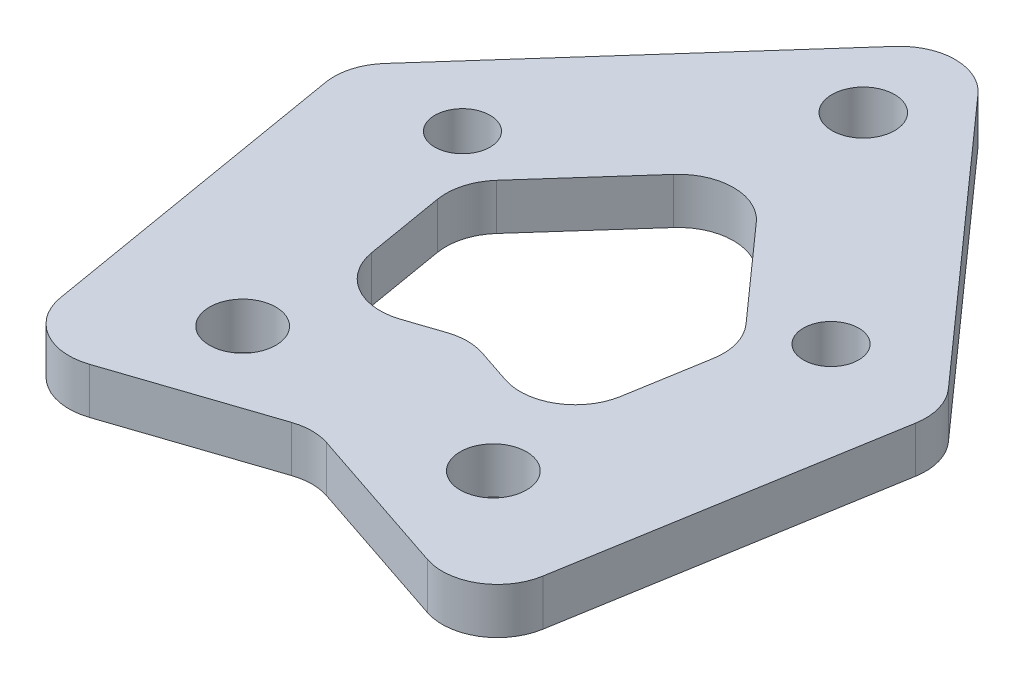
ISO-10303-21;
HEADER;
FILE_DESCRIPTION(('STEP AP214'),'2;1');
FILE_NAME('part.step','',(''),(''),'','','');
FILE_SCHEMA(('AUTOMOTIVE_DESIGN { 1 0 10303 214 1 1 1 1 }'));
ENDSEC;
DATA;
#1=APPLICATION_CONTEXT('core data for automotive mechanical design processes');
#2=APPLICATION_PROTOCOL_DEFINITION('international standard','automotive_design',2000,#1);
#3=PRODUCT_CONTEXT('',#1,'mechanical');
#4=PRODUCT('Part','Part','',(#3));
#5=PRODUCT_RELATED_PRODUCT_CATEGORY('part','',(#4));
#6=PRODUCT_DEFINITION_FORMATION('','',#4);
#7=PRODUCT_DEFINITION_CONTEXT('part definition',#1,'design');
#8=PRODUCT_DEFINITION('design','',#6,#7);
#9=PRODUCT_DEFINITION_SHAPE('','',#8);
#10=(LENGTH_UNIT() NAMED_UNIT(*) SI_UNIT(.MILLI.,.METRE.));
#11=(NAMED_UNIT(*) PLANE_ANGLE_UNIT() SI_UNIT($,.RADIAN.));
#12=(NAMED_UNIT(*) SI_UNIT($,.STERADIAN.) SOLID_ANGLE_UNIT());
#13=UNCERTAINTY_MEASURE_WITH_UNIT(LENGTH_MEASURE(1.E-05),#10,'distance_accuracy_value','');
#14=(GEOMETRIC_REPRESENTATION_CONTEXT(3) GLOBAL_UNCERTAINTY_ASSIGNED_CONTEXT((#13)) GLOBAL_UNIT_ASSIGNED_CONTEXT((#10,
#11,#12)) REPRESENTATION_CONTEXT('',''));
#15=CARTESIAN_POINT('',(0.,0.,0.));
#16=DIRECTION('',(0.,0.,1.));
#17=DIRECTION('',(1.,0.,0.));
#18=AXIS2_PLACEMENT_3D('',#15,#16,#17);
#19=CARTESIAN_POINT('',(32.3850000005408,1.5875,-43.1799999978764));
#20=DIRECTION('',(-0.746844593870613,0.,0.664998610980683));
#21=DIRECTION('',(0.664998610980683,0.,0.746844593870614));
#22=AXIS2_PLACEMENT_3D('',#19,#20,#21);
#23=PLANE('',#22);
#24=DIRECTION('',(-0.664998610980683,0.,-0.746844593870614));
#25=VECTOR('',#24,1.);
#26=CARTESIAN_POINT('',(32.3850000005408,-1.5875,-43.1799999978764));
#27=LINE('',#26,#25);
#28=CARTESIAN_POINT('',(51.8065062711757,-1.5875,-21.3681544939327));
#29=VERTEX_POINT('',#28);
#30=CARTESIAN_POINT('',(35.2304779031879,-1.5875,-39.9843094302882));
#31=VERTEX_POINT('',#30);
#32=EDGE_CURVE('E329',#29,#31,#27,.T.);
#33=ORIENTED_EDGE('',*,*,#32,.T.);
#34=DIRECTION('',(0.,-1.,0.));
#35=VECTOR('',#34,1.);
#36=CARTESIAN_POINT('',(35.2304779031879,1.5875,-39.9843094302882));
#37=LINE('',#36,#35);
#38=CARTESIAN_POINT('',(35.2304779031879,1.5875,-39.9843094302882));
#39=VERTEX_POINT('',#38);
#40=EDGE_CURVE('E465',#31,#39,#37,.F.);
#41=ORIENTED_EDGE('',*,*,#40,.T.);
#42=DIRECTION('',(-0.664998610980683,0.,-0.746844593870614));
#43=VECTOR('',#42,1.);
#44=CARTESIAN_POINT('',(32.3850000005408,1.5875,-43.1799999978764));
#45=LINE('',#44,#43);
#46=CARTESIAN_POINT('',(51.8065062711757,1.5875,-21.3681544939327));
#47=VERTEX_POINT('',#46);
#48=EDGE_CURVE('E333',#47,#39,#45,.T.);
#49=ORIENTED_EDGE('',*,*,#48,.F.);
#50=DIRECTION('',(0.,-1.,0.));
#51=VECTOR('',#50,1.);
#52=CARTESIAN_POINT('',(51.8065062711757,1.5875,-21.3681544939327));
#53=LINE('',#52,#51);
#54=EDGE_CURVE('E461',#47,#29,#53,.T.);
#55=ORIENTED_EDGE('',*,*,#54,.T.);
#56=EDGE_LOOP('',(#33,#41,#49,#55));
#57=FACE_BOUND('',#56,.T.);
#58=ADVANCED_FACE('F49',(#57),#23,.F.);
#59=CARTESIAN_POINT('',(11.7475000005408,1.5875,-20.0024999978764));
#60=DIRECTION('',(0.746844593870614,0.,0.664998610980683));
#61=DIRECTION('',(0.664998610980683,0.,-0.746844593870614));
#62=AXIS2_PLACEMENT_3D('',#59,#60,#61);
#63=PLANE('',#62);
#64=DIRECTION('',(-0.664998610980683,0.,0.746844593870614));
#65=VECTOR('',#64,1.);
#66=CARTESIAN_POINT('',(11.7475000005408,-1.5875,-20.0024999978764));
#67=LINE('',#66,#65);
#68=CARTESIAN_POINT('',(29.5395220978938,-1.5875,-39.9843094302882));
#69=VERTEX_POINT('',#68);
#70=CARTESIAN_POINT('',(12.963493729906,-1.5875,-21.3681544939327));
#71=VERTEX_POINT('',#70);
#72=EDGE_CURVE('E361',#69,#71,#67,.T.);
#73=ORIENTED_EDGE('',*,*,#72,.T.);
#74=DIRECTION('',(0.,-1.,0.));
#75=VECTOR('',#74,1.);
#76=CARTESIAN_POINT('',(12.963493729906,1.5875,-21.3681544939327));
#77=LINE('',#76,#75);
#78=CARTESIAN_POINT('',(12.963493729906,1.5875,-21.3681544939327));
#79=VERTEX_POINT('',#78);
#80=EDGE_CURVE('E458',#71,#79,#77,.F.);
#81=ORIENTED_EDGE('',*,*,#80,.T.);
#82=DIRECTION('',(-0.664998610980683,0.,0.746844593870614));
#83=VECTOR('',#82,1.);
#84=CARTESIAN_POINT('',(11.7475000005408,1.5875,-20.0024999978764));
#85=LINE('',#84,#83);
#86=CARTESIAN_POINT('',(29.5395220978938,1.5875,-39.9843094302882));
#87=VERTEX_POINT('',#86);
#88=EDGE_CURVE('E337',#87,#79,#85,.T.);
#89=ORIENTED_EDGE('',*,*,#88,.F.);
#90=DIRECTION('',(0.,-1.,0.));
#91=VECTOR('',#90,1.);
#92=CARTESIAN_POINT('',(29.5395220978938,1.5875,-39.9843094302882));
#93=LINE('',#92,#91);
#94=EDGE_CURVE('E455',#87,#69,#93,.T.);
#95=ORIENTED_EDGE('',*,*,#94,.T.);
#96=EDGE_LOOP('',(#73,#81,#89,#95));
#97=FACE_BOUND('',#96,.T.);
#98=ADVANCED_FACE('F550',(#97),#63,.F.);
#99=CARTESIAN_POINT('',(11.7475000005408,1.5875,-20.0024999978764));
#100=DIRECTION('',(0.986013297183269,0.,-0.166666666666667));
#101=DIRECTION('',(-0.166666666666667,0.,-0.98601329718327));
#102=AXIS2_PLACEMENT_3D('',#99,#100,#101);
#103=PLANE('',#102);
#104=DIRECTION('',(0.166666666666667,0.,0.986013297183269));
#105=VECTOR('',#104,1.);
#106=CARTESIAN_POINT('',(11.7475000005408,1.5875,-20.0024999978764));
#107=LINE('',#106,#105);
#108=CARTESIAN_POINT('',(12.0522609702848,1.5875,-18.1995097860963));
#109=VERTEX_POINT('',#108);
#110=CARTESIAN_POINT('',(15.7675907402736,1.5875,3.7806775536828));
#111=VERTEX_POINT('',#110);
#112=EDGE_CURVE('E342',#109,#111,#107,.T.);
#113=ORIENTED_EDGE('',*,*,#112,.F.);
#114=DIRECTION('',(0.,-1.,0.));
#115=VECTOR('',#114,1.);
#116=CARTESIAN_POINT('',(12.0522609702848,1.5875,-18.1995097860963));
#117=LINE('',#116,#115);
#118=CARTESIAN_POINT('',(12.0522609702848,-1.5875,-18.1995097860963));
#119=VERTEX_POINT('',#118);
#120=EDGE_CURVE('E451',#109,#119,#117,.T.);
#121=ORIENTED_EDGE('',*,*,#120,.T.);
#122=DIRECTION('',(0.166666666666667,0.,0.986013297183269));
#123=VECTOR('',#122,1.);
#124=CARTESIAN_POINT('',(11.7475000005408,-1.5875,-20.0024999978764));
#125=LINE('',#124,#123);
#126=CARTESIAN_POINT('',(15.7675907402736,-1.5875,3.7806775536828));
#127=VERTEX_POINT('',#126);
#128=EDGE_CURVE('E364',#119,#127,#125,.T.);
#129=ORIENTED_EDGE('',*,*,#128,.T.);
#130=DIRECTION('',(0.,-1.,0.));
#131=VECTOR('',#130,1.);
#132=CARTESIAN_POINT('',(15.7675907402736,1.5875,3.7806775536828));
#133=LINE('',#132,#131);
#134=EDGE_CURVE('E448',#127,#111,#133,.F.);
#135=ORIENTED_EDGE('',*,*,#134,.T.);
#136=EDGE_LOOP('',(#113,#121,#129,#135));
#137=FACE_BOUND('',#136,.T.);
#138=ADVANCED_FACE('F558',(#137),#103,.F.);
#139=CARTESIAN_POINT('',(16.5100000005408,1.5875,8.17282996913553));
#140=DIRECTION('',(-0.317499609648524,0.,-0.948258402479533));
#141=DIRECTION('',(-0.948258402479533,0.,0.317499609648524));
#142=AXIS2_PLACEMENT_3D('',#139,#140,#141);
#143=PLANE('',#142);
#144=DIRECTION('',(0.948258402479533,0.,-0.317499609648524));
#145=VECTOR('',#144,1.);
#146=CARTESIAN_POINT('',(16.5100000005408,-1.5875,8.17282996913553));
#147=LINE('',#146,#145);
#148=CARTESIAN_POINT('',(20.7339749153028,-1.5875,6.75854206712982));
#149=VERTEX_POINT('',#148);
#150=CARTESIAN_POINT('',(31.17532648778,-1.5875,3.26252764764666));
#151=VERTEX_POINT('',#150);
#152=EDGE_CURVE('E368',#149,#151,#147,.T.);
#153=ORIENTED_EDGE('',*,*,#152,.T.);
#154=DIRECTION('',(0.,-1.,0.));
#155=VECTOR('',#154,1.);
#156=CARTESIAN_POINT('',(31.17532648778,1.5875,3.26252764764667));
#157=LINE('',#156,#155);
#158=CARTESIAN_POINT('',(31.17532648778,1.5875,3.26252764764666));
#159=VERTEX_POINT('',#158);
#160=EDGE_CURVE('E260',#151,#159,#157,.F.);
#161=ORIENTED_EDGE('',*,*,#160,.T.);
#162=DIRECTION('',(0.948258402479533,0.,-0.317499609648524));
#163=VECTOR('',#162,1.);
#164=CARTESIAN_POINT('',(16.5100000005408,1.5875,8.17282996913553));
#165=LINE('',#164,#163);
#166=CARTESIAN_POINT('',(20.7339749153028,1.5875,6.75854206712982));
#167=VERTEX_POINT('',#166);
#168=EDGE_CURVE('E346',#167,#159,#165,.T.);
#169=ORIENTED_EDGE('',*,*,#168,.F.);
#170=DIRECTION('',(0.,-1.,0.));
#171=VECTOR('',#170,1.);
#172=CARTESIAN_POINT('',(20.7339749153028,1.5875,6.75854206712982));
#173=LINE('',#172,#171);
#174=EDGE_CURVE('E482',#167,#149,#173,.T.);
#175=ORIENTED_EDGE('',*,*,#174,.T.);
#176=EDGE_LOOP('',(#153,#161,#169,#175));
#177=FACE_BOUND('',#176,.T.);
#178=ADVANCED_FACE('F520',(#177),#143,.F.);
#179=CARTESIAN_POINT('',(32.3850000005408,1.5875,2.85750000212361));
#180=DIRECTION('',(0.317499609648524,0.,-0.948258402479533));
#181=DIRECTION('',(-0.948258402479533,0.,-0.317499609648524));
#182=AXIS2_PLACEMENT_3D('',#179,#180,#181);
#183=PLANE('',#182);
#184=DIRECTION('',(0.948258402479533,0.,0.317499609648524));
#185=VECTOR('',#184,1.);
#186=CARTESIAN_POINT('',(32.3850000005408,1.5875,2.85750000212361));
#187=LINE('',#186,#185);
#188=CARTESIAN_POINT('',(33.5946735133017,1.5875,3.26252764764667));
#189=VERTEX_POINT('',#188);
#190=CARTESIAN_POINT('',(44.0360250857789,1.5875,6.75854206712982));
#191=VERTEX_POINT('',#190);
#192=EDGE_CURVE('E350',#189,#191,#187,.T.);
#193=ORIENTED_EDGE('',*,*,#192,.F.);
#194=DIRECTION('',(0.,-1.,0.));
#195=VECTOR('',#194,1.);
#196=CARTESIAN_POINT('',(33.5946735133017,-1.5875,3.26252764764667));
#197=LINE('',#196,#195);
#198=CARTESIAN_POINT('',(33.5946735133017,-1.5875,3.26252764764667));
#199=VERTEX_POINT('',#198);
#200=EDGE_CURVE('E478',#189,#199,#197,.T.);
#201=ORIENTED_EDGE('',*,*,#200,.T.);
#202=DIRECTION('',(0.948258402479533,0.,0.317499609648524));
#203=VECTOR('',#202,1.);
#204=CARTESIAN_POINT('',(32.3850000005408,-1.5875,2.85750000212361));
#205=LINE('',#204,#203);
#206=CARTESIAN_POINT('',(44.0360250857789,-1.5875,6.75854206712982));
#207=VERTEX_POINT('',#206);
#208=EDGE_CURVE('E372',#199,#207,#205,.T.);
#209=ORIENTED_EDGE('',*,*,#208,.T.);
#210=DIRECTION('',(0.,-1.,0.));
#211=VECTOR('',#210,1.);
#212=CARTESIAN_POINT('',(44.0360250857789,1.5875,6.75854206712982));
#213=LINE('',#212,#211);
#214=EDGE_CURVE('E475',#207,#191,#213,.F.);
#215=ORIENTED_EDGE('',*,*,#214,.T.);
#216=EDGE_LOOP('',(#193,#201,#209,#215));
#217=FACE_BOUND('',#216,.T.);
#218=ADVANCED_FACE('F529',(#217),#183,.F.);
#219=CARTESIAN_POINT('',(48.2600000005408,1.5875,8.17282996913553));
#220=DIRECTION('',(-0.986013297183269,0.,-0.166666666666667));
#221=DIRECTION('',(-0.166666666666667,0.,0.986013297183269));
#222=AXIS2_PLACEMENT_3D('',#219,#220,#221);
#223=PLANE('',#222);
#224=DIRECTION('',(0.166666666666667,0.,-0.986013297183269));
#225=VECTOR('',#224,1.);
#226=CARTESIAN_POINT('',(48.2600000005408,-1.5875,8.17282996913553));
#227=LINE('',#226,#225);
#228=CARTESIAN_POINT('',(49.002409260808,-1.5875,3.7806775536828));
#229=VERTEX_POINT('',#228);
#230=CARTESIAN_POINT('',(52.7177390307969,-1.5875,-18.1995097860963));
#231=VERTEX_POINT('',#230);
#232=EDGE_CURVE('E338',#229,#231,#227,.T.);
#233=ORIENTED_EDGE('',*,*,#232,.T.);
#234=DIRECTION('',(0.,-1.,0.));
#235=VECTOR('',#234,1.);
#236=CARTESIAN_POINT('',(52.7177390307969,1.5875,-18.1995097860963));
#237=LINE('',#236,#235);
#238=CARTESIAN_POINT('',(52.7177390307969,1.5875,-18.1995097860963));
#239=VERTEX_POINT('',#238);
#240=EDGE_CURVE('E472',#231,#239,#237,.F.);
#241=ORIENTED_EDGE('',*,*,#240,.T.);
#242=DIRECTION('',(0.166666666666667,0.,-0.986013297183269));
#243=VECTOR('',#242,1.);
#244=CARTESIAN_POINT('',(48.2600000005408,1.5875,8.17282996913553));
#245=LINE('',#244,#243);
#246=CARTESIAN_POINT('',(49.002409260808,1.5875,3.7806775536828));
#247=VERTEX_POINT('',#246);
#248=EDGE_CURVE('E354',#247,#239,#245,.T.);
#249=ORIENTED_EDGE('',*,*,#248,.F.);
#250=DIRECTION('',(0.,-1.,0.));
#251=VECTOR('',#250,1.);
#252=CARTESIAN_POINT('',(49.002409260808,1.5875,3.7806775536828));
#253=LINE('',#252,#251);
#254=EDGE_CURVE('E468',#247,#229,#253,.T.);
#255=ORIENTED_EDGE('',*,*,#254,.T.);
#256=EDGE_LOOP('',(#233,#241,#249,#255));
#257=FACE_BOUND('',#256,.T.);
#258=ADVANCED_FACE('F536',(#257),#223,.F.);
#259=CARTESIAN_POINT('',(0.,1.5875,0.));
#260=DIRECTION('',(0.,1.,0.));
#261=DIRECTION('',(0.,0.,1.));
#262=AXIS2_PLACEMENT_3D('',#259,#260,#261);
#263=PLANE('',#262);
#264=DIRECTION('',(0.948258402479533,0.,0.317499609648524));
#265=VECTOR('',#264,1.);
#266=CARTESIAN_POINT('',(32.3850000005408,1.5875,-7.85687908846324));
#267=LINE('',#266,#265);
#268=CARTESIAN_POINT('',(33.5946735133017,1.5875,-7.45185144294019));
#269=VERTEX_POINT('',#268);
#270=CARTESIAN_POINT('',(35.9978880137761,1.5875,-6.6471977074108));
#271=VERTEX_POINT('',#270);
#272=EDGE_CURVE('E288',#269,#271,#267,.T.);
#273=ORIENTED_EDGE('',*,*,#272,.F.);
#274=CARTESIAN_POINT('',(32.3850000005408,1.5875,-3.83898692949317));
#275=DIRECTION('',(0.,1.,0.));
#276=DIRECTION('',(0.,0.,1.));
#277=AXIS2_PLACEMENT_3D('',#274,#275,#276);
#278=CIRCLE('',#277,3.81);
#279=CARTESIAN_POINT('',(31.17532648778,1.5875,-7.45185144294019));
#280=VERTEX_POINT('',#279);
#281=EDGE_CURVE('E408',#269,#280,#278,.T.);
#282=ORIENTED_EDGE('',*,*,#281,.T.);
#283=DIRECTION('',(0.948258402479533,0.,-0.317499609648524));
#284=VECTOR('',#283,1.);
#285=CARTESIAN_POINT('',(24.5481370725437,1.5875,-5.23290980540509));
#286=LINE('',#285,#284);
#287=CARTESIAN_POINT('',(28.7721119873056,1.5875,-6.6471977074108));
#288=VERTEX_POINT('',#287);
#289=EDGE_CURVE('E870',#288,#280,#286,.T.);
#290=ORIENTED_EDGE('',*,*,#289,.F.);
#291=CARTESIAN_POINT('',(27.5624384745447,1.5875,-10.2600622208578));
#292=DIRECTION('',(0.,1.,0.));
#293=DIRECTION('',(0.,0.,1.));
#294=AXIS2_PLACEMENT_3D('',#291,#292,#293);
#295=CIRCLE('',#294,3.81);
#296=CARTESIAN_POINT('',(23.8057278122765,1.5875,-9.62506222085782));
#297=VERTEX_POINT('',#296);
#298=EDGE_CURVE('E496',#288,#297,#295,.F.);
#299=ORIENTED_EDGE('',*,*,#298,.T.);
#300=DIRECTION('',(0.166666666666666,0.,0.986013297183269));
#301=VECTOR('',#300,1.);
#302=CARTESIAN_POINT('',(22.5780910192401,1.5875,-16.8878594331294));
#303=LINE('',#302,#301);
#304=CARTESIAN_POINT('',(22.8828519889841,1.5875,-15.0848692213493));
#305=VERTEX_POINT('',#304);
#306=EDGE_CURVE('E872',#305,#297,#303,.T.);
#307=ORIENTED_EDGE('',*,*,#306,.F.);
#308=CARTESIAN_POINT('',(26.6395626512523,1.5875,-15.7198692213493));
#309=DIRECTION('',(0.,1.,0.));
#310=DIRECTION('',(0.,0.,1.));
#311=AXIS2_PLACEMENT_3D('',#308,#309,#310);
#312=CIRCLE('',#311,3.81);
#313=CARTESIAN_POINT('',(23.7940847486053,1.5875,-18.2535139291857));
#314=VERTEX_POINT('',#313);
#315=EDGE_CURVE('E502',#305,#314,#312,.F.);
#316=ORIENTED_EDGE('',*,*,#315,.T.);
#317=DIRECTION('',(-0.664998610980683,0.,0.746844593870614));
#318=VECTOR('',#317,1.);
#319=CARTESIAN_POINT('',(32.3850000005408,1.5875,-27.9017725967441));
#320=LINE('',#319,#318);
#321=CARTESIAN_POINT('',(29.5395220978938,1.5875,-24.7060820291559));
#322=VERTEX_POINT('',#321);
#323=EDGE_CURVE('E878',#322,#314,#320,.T.);
#324=ORIENTED_EDGE('',*,*,#323,.F.);
#325=CARTESIAN_POINT('',(32.3850000005408,1.5875,-22.1724373213195));
#326=DIRECTION('',(0.,1.,0.));
#327=DIRECTION('',(0.,0.,1.));
#328=AXIS2_PLACEMENT_3D('',#325,#326,#327);
#329=CIRCLE('',#328,3.81);
#330=CARTESIAN_POINT('',(35.2304779031879,1.5875,-24.7060820291559));
#331=VERTEX_POINT('',#330);
#332=EDGE_CURVE('E278',#322,#331,#329,.F.);
#333=ORIENTED_EDGE('',*,*,#332,.T.);
#334=DIRECTION('',(-0.664998610980683,0.,-0.746844593870613));
#335=VECTOR('',#334,1.);
#336=CARTESIAN_POINT('',(42.1919089818416,1.5875,-16.8878594331294));
#337=LINE('',#336,#335);
#338=CARTESIAN_POINT('',(40.9759152524764,1.5875,-18.2535139291857));
#339=VERTEX_POINT('',#338);
#340=EDGE_CURVE('E266',#339,#331,#337,.T.);
#341=ORIENTED_EDGE('',*,*,#340,.F.);
#342=CARTESIAN_POINT('',(38.1304373498294,1.5875,-15.7198692213493));
#343=DIRECTION('',(0.,1.,0.));
#344=DIRECTION('',(0.,0.,1.));
#345=AXIS2_PLACEMENT_3D('',#342,#343,#344);
#346=CIRCLE('',#345,3.81);
#347=CARTESIAN_POINT('',(41.8871480120976,1.5875,-15.0848692213493));
#348=VERTEX_POINT('',#347);
#349=EDGE_CURVE('E248',#339,#348,#346,.F.);
#350=ORIENTED_EDGE('',*,*,#349,.T.);
#351=DIRECTION('',(0.166666666666666,0.,-0.986013297183269));
#352=VECTOR('',#351,1.);
#353=CARTESIAN_POINT('',(40.221862928538,1.5875,-5.23290980540509));
#354=LINE('',#353,#352);
#355=CARTESIAN_POINT('',(40.9642721888052,1.5875,-9.62506222085782));
#356=VERTEX_POINT('',#355);
#357=EDGE_CURVE('E281',#356,#348,#354,.T.);
#358=ORIENTED_EDGE('',*,*,#357,.F.);
#359=CARTESIAN_POINT('',(37.207561526537,1.5875,-10.2600622208578));
#360=DIRECTION('',(0.,1.,0.));
#361=DIRECTION('',(0.,0.,1.));
#362=AXIS2_PLACEMENT_3D('',#359,#360,#361);
#363=CIRCLE('',#362,3.81);
#364=EDGE_CURVE('E490',#356,#271,#363,.F.);
#365=ORIENTED_EDGE('',*,*,#364,.T.);
#366=EDGE_LOOP('',(#273,#282,#290,#299,#307,#316,#324,#333,#341,#350,#358,#365));
#367=FACE_BOUND('',#366,.T.);
#368=CARTESIAN_POINT('',(23.7474827219681,1.5875,-0.795511848872547));
#369=DIRECTION('',(0.,1.,0.));
#370=DIRECTION('',(0.,0.,1.));
#371=AXIS2_PLACEMENT_3D('',#368,#369,#370);
#372=CIRCLE('',#371,2.28600000002914);
#373=CARTESIAN_POINT('',(23.7474827219681,1.5875,1.49048815115659));
#374=VERTEX_POINT('',#373);
#375=EDGE_CURVE('E321',#374,#374,#372,.T.);
#376=ORIENTED_EDGE('',*,*,#375,.F.);
#377=EDGE_LOOP('',(#376));
#378=FACE_BOUND('',#377,.T.);
#379=CARTESIAN_POINT('',(41.0225172791136,1.5875,-0.79551184887255));
#380=DIRECTION('',(0.,1.,0.));
#381=DIRECTION('',(0.,0.,-1.));
#382=AXIS2_PLACEMENT_3D('',#379,#380,#381);
#383=CIRCLE('',#382,2.28600000002914);
#384=CARTESIAN_POINT('',(41.0225172791136,1.5875,-3.08151184890169));
#385=VERTEX_POINT('',#384);
#386=EDGE_CURVE('E313',#385,#385,#383,.T.);
#387=ORIENTED_EDGE('',*,*,#386,.F.);
#388=EDGE_LOOP('',(#387));
#389=FACE_BOUND('',#388,.T.);
#390=CARTESIAN_POINT('',(32.3850000005408,1.5875,-34.9250000245181));
#391=DIRECTION('',(0.,1.,0.));
#392=DIRECTION('',(0.,0.,1.));
#393=AXIS2_PLACEMENT_3D('',#390,#391,#392);
#394=CIRCLE('',#393,2.15900000155991);
#395=CARTESIAN_POINT('',(32.3850000005408,1.5875,-32.7660000229582));
#396=VERTEX_POINT('',#395);
#397=EDGE_CURVE('E305',#396,#396,#394,.T.);
#398=ORIENTED_EDGE('',*,*,#397,.F.);
#399=EDGE_LOOP('',(#398));
#400=FACE_BOUND('',#399,.T.);
#401=CARTESIAN_POINT('',(45.0849999984229,1.5875,-20.0024999997719));
#402=DIRECTION('',(0.,1.,0.));
#403=DIRECTION('',(0.,0.,1.));
#404=AXIS2_PLACEMENT_3D('',#401,#402,#403);
#405=CIRCLE('',#404,1.90500000157267);
#406=CARTESIAN_POINT('',(45.0849999984229,1.5875,-18.0974999981992));
#407=VERTEX_POINT('',#406);
#408=EDGE_CURVE('E297',#407,#407,#405,.T.);
#409=ORIENTED_EDGE('',*,*,#408,.F.);
#410=EDGE_LOOP('',(#409));
#411=FACE_BOUND('',#410,.T.);
#412=CARTESIAN_POINT('',(19.684999998424,1.5875,-20.0025000024673));
#413=DIRECTION('',(0.,1.,0.));
#414=DIRECTION('',(0.,0.,1.));
#415=AXIS2_PLACEMENT_3D('',#412,#413,#414);
#416=CIRCLE('',#415,1.90500000078473);
#417=CARTESIAN_POINT('',(19.684999998424,1.5875,-18.0975000016826));
#418=VERTEX_POINT('',#417);
#419=EDGE_CURVE('E325',#418,#418,#416,.T.);
#420=ORIENTED_EDGE('',*,*,#419,.F.);
#421=EDGE_LOOP('',(#420));
#422=FACE_BOUND('',#421,.T.);
#423=ORIENTED_EDGE('',*,*,#88,.T.);
#424=CARTESIAN_POINT('',(15.8089716325531,1.5875,-18.8345097860963));
#425=DIRECTION('',(0.,1.,0.));
#426=DIRECTION('',(0.,0.,1.));
#427=AXIS2_PLACEMENT_3D('',#424,#425,#426);
#428=CIRCLE('',#427,3.81);
#429=EDGE_CURVE('E405',#79,#109,#428,.T.);
#430=ORIENTED_EDGE('',*,*,#429,.T.);
#431=ORIENTED_EDGE('',*,*,#112,.T.);
#432=CARTESIAN_POINT('',(19.5243014025419,1.5875,3.1456775536828));
#433=DIRECTION('',(0.,1.,0.));
#434=DIRECTION('',(0.,0.,1.));
#435=AXIS2_PLACEMENT_3D('',#432,#433,#434);
#436=CIRCLE('',#435,3.81);
#437=EDGE_CURVE('E396',#111,#167,#436,.T.);
#438=ORIENTED_EDGE('',*,*,#437,.T.);
#439=ORIENTED_EDGE('',*,*,#168,.T.);
#440=CARTESIAN_POINT('',(32.3850000005408,1.5875,6.87539216109368));
#441=DIRECTION('',(0.,1.,0.));
#442=DIRECTION('',(0.,0.,1.));
#443=AXIS2_PLACEMENT_3D('',#440,#441,#442);
#444=CIRCLE('',#443,3.81);
#445=EDGE_CURVE('E11',#159,#189,#444,.F.);
#446=ORIENTED_EDGE('',*,*,#445,.T.);
#447=ORIENTED_EDGE('',*,*,#192,.T.);
#448=CARTESIAN_POINT('',(45.2456985985398,1.5875,3.1456775536828));
#449=DIRECTION('',(0.,1.,0.));
#450=DIRECTION('',(0.,0.,1.));
#451=AXIS2_PLACEMENT_3D('',#448,#449,#450);
#452=CIRCLE('',#451,3.81);
#453=EDGE_CURVE('E393',#191,#247,#452,.T.);
#454=ORIENTED_EDGE('',*,*,#453,.T.);
#455=ORIENTED_EDGE('',*,*,#248,.T.);
#456=CARTESIAN_POINT('',(48.9610283685286,1.5875,-18.8345097860963));
#457=DIRECTION('',(0.,1.,0.));
#458=DIRECTION('',(0.,0.,1.));
#459=AXIS2_PLACEMENT_3D('',#456,#457,#458);
#460=CIRCLE('',#459,3.81);
#461=EDGE_CURVE('E399',#239,#47,#460,.T.);
#462=ORIENTED_EDGE('',*,*,#461,.T.);
#463=ORIENTED_EDGE('',*,*,#48,.T.);
#464=CARTESIAN_POINT('',(32.3850000005408,1.5875,-37.4506647224518));
#465=DIRECTION('',(0.,1.,0.));
#466=DIRECTION('',(0.,0.,1.));
#467=AXIS2_PLACEMENT_3D('',#464,#465,#466);
#468=CIRCLE('',#467,3.81);
#469=EDGE_CURVE('E402',#39,#87,#468,.T.);
#470=ORIENTED_EDGE('',*,*,#469,.T.);
#471=EDGE_LOOP('',(#423,#430,#431,#438,#439,#446,#447,#454,#455,#462,#463,#470));
#472=FACE_BOUND('',#471,.T.);
#473=ADVANCED_FACE('F275',(#367,#378,#389,#400,#411,#422,#472),#263,.T.);
#474=CARTESIAN_POINT('',(0.,-1.5875,0.));
#475=DIRECTION('',(0.,1.,0.));
#476=DIRECTION('',(0.,0.,1.));
#477=AXIS2_PLACEMENT_3D('',#474,#475,#476);
#478=PLANE('',#477);
#479=DIRECTION('',(0.948258402479533,0.,-0.317499609648524));
#480=VECTOR('',#479,1.);
#481=CARTESIAN_POINT('',(24.5481370725437,-1.5875,-5.23290980540509));
#482=LINE('',#481,#480);
#483=CARTESIAN_POINT('',(28.7721119873056,-1.5875,-6.6471977074108));
#484=VERTEX_POINT('',#483);
#485=CARTESIAN_POINT('',(31.17532648778,-1.5875,-7.45185144294019));
#486=VERTEX_POINT('',#485);
#487=EDGE_CURVE('E839',#484,#486,#482,.T.);
#488=ORIENTED_EDGE('',*,*,#487,.T.);
#489=CARTESIAN_POINT('',(32.3850000005408,-1.5875,-3.83898692949317));
#490=DIRECTION('',(0.,1.,0.));
#491=DIRECTION('',(0.,0.,1.));
#492=AXIS2_PLACEMENT_3D('',#489,#490,#491);
#493=CIRCLE('',#492,3.81);
#494=CARTESIAN_POINT('',(33.5946735133017,-1.5875,-7.45185144294019));
#495=VERTEX_POINT('',#494);
#496=EDGE_CURVE('E431',#486,#495,#493,.F.);
#497=ORIENTED_EDGE('',*,*,#496,.T.);
#498=DIRECTION('',(0.948258402479533,0.,0.317499609648524));
#499=VECTOR('',#498,1.);
#500=CARTESIAN_POINT('',(32.3850000005408,-1.5875,-7.85687908846324));
#501=LINE('',#500,#499);
#502=CARTESIAN_POINT('',(35.9978880137761,-1.5875,-6.6471977074108));
#503=VERTEX_POINT('',#502);
#504=EDGE_CURVE('E861',#495,#503,#501,.T.);
#505=ORIENTED_EDGE('',*,*,#504,.T.);
#506=CARTESIAN_POINT('',(37.207561526537,-1.5875,-10.2600622208578));
#507=DIRECTION('',(0.,1.,0.));
#508=DIRECTION('',(0.,0.,1.));
#509=AXIS2_PLACEMENT_3D('',#506,#507,#508);
#510=CIRCLE('',#509,3.81);
#511=CARTESIAN_POINT('',(40.9642721888052,-1.5875,-9.62506222085782));
#512=VERTEX_POINT('',#511);
#513=EDGE_CURVE('E493',#503,#512,#510,.T.);
#514=ORIENTED_EDGE('',*,*,#513,.T.);
#515=DIRECTION('',(0.166666666666666,0.,-0.986013297183269));
#516=VECTOR('',#515,1.);
#517=CARTESIAN_POINT('',(40.221862928538,-1.5875,-5.23290980540509));
#518=LINE('',#517,#516);
#519=CARTESIAN_POINT('',(41.8871480120976,-1.5875,-15.0848692213493));
#520=VERTEX_POINT('',#519);
#521=EDGE_CURVE('E884',#512,#520,#518,.T.);
#522=ORIENTED_EDGE('',*,*,#521,.T.);
#523=CARTESIAN_POINT('',(38.1304373498294,-1.5875,-15.7198692213493));
#524=DIRECTION('',(0.,1.,0.));
#525=DIRECTION('',(0.,0.,1.));
#526=AXIS2_PLACEMENT_3D('',#523,#524,#525);
#527=CIRCLE('',#526,3.81);
#528=CARTESIAN_POINT('',(40.9759152524764,-1.5875,-18.2535139291857));
#529=VERTEX_POINT('',#528);
#530=EDGE_CURVE('E259',#520,#529,#527,.T.);
#531=ORIENTED_EDGE('',*,*,#530,.T.);
#532=DIRECTION('',(-0.664998610980683,0.,-0.746844593870613));
#533=VECTOR('',#532,1.);
#534=CARTESIAN_POINT('',(42.1919089818416,-1.5875,-16.8878594331294));
#535=LINE('',#534,#533);
#536=CARTESIAN_POINT('',(35.2304779031879,-1.5875,-24.7060820291559));
#537=VERTEX_POINT('',#536);
#538=EDGE_CURVE('E269',#529,#537,#535,.T.);
#539=ORIENTED_EDGE('',*,*,#538,.T.);
#540=CARTESIAN_POINT('',(32.3850000005408,-1.5875,-22.1724373213195));
#541=DIRECTION('',(0.,1.,0.));
#542=DIRECTION('',(0.,0.,1.));
#543=AXIS2_PLACEMENT_3D('',#540,#541,#542);
#544=CIRCLE('',#543,3.81);
#545=CARTESIAN_POINT('',(29.5395220978938,-1.5875,-24.7060820291559));
#546=VERTEX_POINT('',#545);
#547=EDGE_CURVE('E510',#537,#546,#544,.T.);
#548=ORIENTED_EDGE('',*,*,#547,.T.);
#549=DIRECTION('',(-0.664998610980683,0.,0.746844593870614));
#550=VECTOR('',#549,1.);
#551=CARTESIAN_POINT('',(32.3850000005408,-1.5875,-27.9017725967441));
#552=LINE('',#551,#550);
#553=CARTESIAN_POINT('',(23.7940847486053,-1.5875,-18.2535139291857));
#554=VERTEX_POINT('',#553);
#555=EDGE_CURVE('E280',#546,#554,#552,.T.);
#556=ORIENTED_EDGE('',*,*,#555,.T.);
#557=CARTESIAN_POINT('',(26.6395626512523,-1.5875,-15.7198692213493));
#558=DIRECTION('',(0.,1.,0.));
#559=DIRECTION('',(0.,0.,1.));
#560=AXIS2_PLACEMENT_3D('',#557,#558,#559);
#561=CIRCLE('',#560,3.81);
#562=CARTESIAN_POINT('',(22.8828519889841,-1.5875,-15.0848692213493));
#563=VERTEX_POINT('',#562);
#564=EDGE_CURVE('E505',#554,#563,#561,.T.);
#565=ORIENTED_EDGE('',*,*,#564,.T.);
#566=DIRECTION('',(0.166666666666666,0.,0.986013297183269));
#567=VECTOR('',#566,1.);
#568=CARTESIAN_POINT('',(22.5780910192401,-1.5875,-16.8878594331294));
#569=LINE('',#568,#567);
#570=CARTESIAN_POINT('',(23.8057278122765,-1.5875,-9.62506222085782));
#571=VERTEX_POINT('',#570);
#572=EDGE_CURVE('E286',#563,#571,#569,.T.);
#573=ORIENTED_EDGE('',*,*,#572,.T.);
#574=CARTESIAN_POINT('',(27.5624384745447,-1.5875,-10.2600622208578));
#575=DIRECTION('',(0.,1.,0.));
#576=DIRECTION('',(0.,0.,1.));
#577=AXIS2_PLACEMENT_3D('',#574,#575,#576);
#578=CIRCLE('',#577,3.81);
#579=EDGE_CURVE('E499',#571,#484,#578,.T.);
#580=ORIENTED_EDGE('',*,*,#579,.T.);
#581=EDGE_LOOP('',(#488,#497,#505,#514,#522,#531,#539,#548,#556,#565,#573,#580));
#582=FACE_BOUND('',#581,.T.);
#583=CARTESIAN_POINT('',(23.7474827219681,-1.5875,-0.795511848872547));
#584=DIRECTION('',(0.,1.,0.));
#585=DIRECTION('',(0.,0.,1.));
#586=AXIS2_PLACEMENT_3D('',#583,#584,#585);
#587=CIRCLE('',#586,2.28600000002914);
#588=CARTESIAN_POINT('',(23.7474827219681,-1.5875,1.49048815115659));
#589=VERTEX_POINT('',#588);
#590=EDGE_CURVE('E317',#589,#589,#587,.T.);
#591=ORIENTED_EDGE('',*,*,#590,.T.);
#592=EDGE_LOOP('',(#591));
#593=FACE_BOUND('',#592,.T.);
#594=CARTESIAN_POINT('',(41.0225172791136,-1.5875,-0.79551184887255));
#595=DIRECTION('',(0.,1.,0.));
#596=DIRECTION('',(0.,0.,-1.));
#597=AXIS2_PLACEMENT_3D('',#594,#595,#596);
#598=CIRCLE('',#597,2.28600000002914);
#599=CARTESIAN_POINT('',(41.0225172791136,-1.5875,-3.08151184890169));
#600=VERTEX_POINT('',#599);
#601=EDGE_CURVE('E309',#600,#600,#598,.T.);
#602=ORIENTED_EDGE('',*,*,#601,.T.);
#603=EDGE_LOOP('',(#602));
#604=FACE_BOUND('',#603,.T.);
#605=CARTESIAN_POINT('',(32.3850000005408,-1.5875,-34.9250000245181));
#606=DIRECTION('',(0.,1.,0.));
#607=DIRECTION('',(0.,0.,1.));
#608=AXIS2_PLACEMENT_3D('',#605,#606,#607);
#609=CIRCLE('',#608,2.15900000155991);
#610=CARTESIAN_POINT('',(32.3850000005408,-1.5875,-32.7660000229582));
#611=VERTEX_POINT('',#610);
#612=EDGE_CURVE('E301',#611,#611,#609,.T.);
#613=ORIENTED_EDGE('',*,*,#612,.T.);
#614=EDGE_LOOP('',(#613));
#615=FACE_BOUND('',#614,.T.);
#616=CARTESIAN_POINT('',(45.0849999984229,-1.5875,-20.0024999997719));
#617=DIRECTION('',(0.,1.,0.));
#618=DIRECTION('',(0.,0.,1.));
#619=AXIS2_PLACEMENT_3D('',#616,#617,#618);
#620=CIRCLE('',#619,1.90500000157267);
#621=CARTESIAN_POINT('',(45.0849999984229,-1.5875,-18.0974999981992));
#622=VERTEX_POINT('',#621);
#623=EDGE_CURVE('E292',#622,#622,#620,.T.);
#624=ORIENTED_EDGE('',*,*,#623,.T.);
#625=EDGE_LOOP('',(#624));
#626=FACE_BOUND('',#625,.T.);
#627=CARTESIAN_POINT('',(19.684999998424,-1.5875,-20.0025000024673));
#628=DIRECTION('',(0.,1.,0.));
#629=DIRECTION('',(0.,0.,1.));
#630=AXIS2_PLACEMENT_3D('',#627,#628,#629);
#631=CIRCLE('',#630,1.90500000078473);
#632=CARTESIAN_POINT('',(19.684999998424,-1.5875,-18.0975000016826));
#633=VERTEX_POINT('',#632);
#634=EDGE_CURVE('E296',#633,#633,#631,.T.);
#635=ORIENTED_EDGE('',*,*,#634,.T.);
#636=EDGE_LOOP('',(#635));
#637=FACE_BOUND('',#636,.T.);
#638=ORIENTED_EDGE('',*,*,#128,.F.);
#639=CARTESIAN_POINT('',(15.8089716325531,-1.5875,-18.8345097860963));
#640=DIRECTION('',(0.,1.,0.));
#641=DIRECTION('',(0.,0.,1.));
#642=AXIS2_PLACEMENT_3D('',#639,#640,#641);
#643=CIRCLE('',#642,3.81);
#644=EDGE_CURVE('E68',#119,#71,#643,.F.);
#645=ORIENTED_EDGE('',*,*,#644,.T.);
#646=ORIENTED_EDGE('',*,*,#72,.F.);
#647=CARTESIAN_POINT('',(32.3850000005408,-1.5875,-37.4506647224518));
#648=DIRECTION('',(0.,1.,0.));
#649=DIRECTION('',(0.,0.,1.));
#650=AXIS2_PLACEMENT_3D('',#647,#648,#649);
#651=CIRCLE('',#650,3.81);
#652=EDGE_CURVE('E79',#69,#31,#651,.F.);
#653=ORIENTED_EDGE('',*,*,#652,.T.);
#654=ORIENTED_EDGE('',*,*,#32,.F.);
#655=CARTESIAN_POINT('',(48.9610283685286,-1.5875,-18.8345097860963));
#656=DIRECTION('',(0.,1.,0.));
#657=DIRECTION('',(0.,0.,1.));
#658=AXIS2_PLACEMENT_3D('',#655,#656,#657);
#659=CIRCLE('',#658,3.81);
#660=EDGE_CURVE('E424',#29,#231,#659,.F.);
#661=ORIENTED_EDGE('',*,*,#660,.T.);
#662=ORIENTED_EDGE('',*,*,#232,.F.);
#663=CARTESIAN_POINT('',(45.2456985985398,-1.5875,3.1456775536828));
#664=DIRECTION('',(0.,1.,0.));
#665=DIRECTION('',(0.,0.,1.));
#666=AXIS2_PLACEMENT_3D('',#663,#664,#665);
#667=CIRCLE('',#666,3.81);
#668=EDGE_CURVE('E418',#229,#207,#667,.F.);
#669=ORIENTED_EDGE('',*,*,#668,.T.);
#670=ORIENTED_EDGE('',*,*,#208,.F.);
#671=CARTESIAN_POINT('',(32.3850000005408,-1.5875,6.87539216109368));
#672=DIRECTION('',(0.,1.,0.));
#673=DIRECTION('',(0.,0.,1.));
#674=AXIS2_PLACEMENT_3D('',#671,#672,#673);
#675=CIRCLE('',#674,3.81);
#676=EDGE_CURVE('E58',#199,#151,#675,.T.);
#677=ORIENTED_EDGE('',*,*,#676,.T.);
#678=ORIENTED_EDGE('',*,*,#152,.F.);
#679=CARTESIAN_POINT('',(19.5243014025419,-1.5875,3.1456775536828));
#680=DIRECTION('',(0.,1.,0.));
#681=DIRECTION('',(0.,0.,1.));
#682=AXIS2_PLACEMENT_3D('',#679,#680,#681);
#683=CIRCLE('',#682,3.81);
#684=EDGE_CURVE('E421',#149,#127,#683,.F.);
#685=ORIENTED_EDGE('',*,*,#684,.T.);
#686=EDGE_LOOP('',(#638,#645,#646,#653,#654,#661,#662,#669,#670,#677,#678,#685));
#687=FACE_BOUND('',#686,.T.);
#688=ADVANCED_FACE('F515',(#582,#593,#604,#615,#626,#637,#687),#478,.F.);
#689=CARTESIAN_POINT('',(19.684999998424,1.5875,-20.0025000024673));
#690=DIRECTION('',(0.,-1.,0.));
#691=DIRECTION('',(0.,0.,-1.));
#692=AXIS2_PLACEMENT_3D('',#689,#690,#691);
#693=CYLINDRICAL_SURFACE('',#692,1.90500000078473);
#694=ORIENTED_EDGE('',*,*,#419,.T.);
#695=EDGE_LOOP('',(#694));
#696=FACE_BOUND('',#695,.T.);
#697=ORIENTED_EDGE('',*,*,#634,.F.);
#698=EDGE_LOOP('',(#697));
#699=FACE_BOUND('',#698,.T.);
#700=ADVANCED_FACE('F751',(#696,#699),#693,.F.);
#701=CARTESIAN_POINT('',(45.0849999984229,1.5875,-20.0024999997719));
#702=DIRECTION('',(0.,-1.,0.));
#703=DIRECTION('',(0.,0.,-1.));
#704=AXIS2_PLACEMENT_3D('',#701,#702,#703);
#705=CYLINDRICAL_SURFACE('',#704,1.90500000157267);
#706=ORIENTED_EDGE('',*,*,#408,.T.);
#707=EDGE_LOOP('',(#706));
#708=FACE_BOUND('',#707,.T.);
#709=ORIENTED_EDGE('',*,*,#623,.F.);
#710=EDGE_LOOP('',(#709));
#711=FACE_BOUND('',#710,.T.);
#712=ADVANCED_FACE('F742',(#708,#711),#705,.F.);
#713=CARTESIAN_POINT('',(32.3850000005408,1.5875,-34.9250000245181));
#714=DIRECTION('',(0.,-1.,0.));
#715=DIRECTION('',(0.,0.,-1.));
#716=AXIS2_PLACEMENT_3D('',#713,#714,#715);
#717=CYLINDRICAL_SURFACE('',#716,2.15900000155991);
#718=ORIENTED_EDGE('',*,*,#397,.T.);
#719=EDGE_LOOP('',(#718));
#720=FACE_BOUND('',#719,.T.);
#721=ORIENTED_EDGE('',*,*,#612,.F.);
#722=EDGE_LOOP('',(#721));
#723=FACE_BOUND('',#722,.T.);
#724=ADVANCED_FACE('F733',(#720,#723),#717,.F.);
#725=CARTESIAN_POINT('',(41.0225172791136,1.5875,-0.79551184887255));
#726=DIRECTION('',(0.,-1.,0.));
#727=DIRECTION('',(0.,0.,-1.));
#728=AXIS2_PLACEMENT_3D('',#725,#726,#727);
#729=CYLINDRICAL_SURFACE('',#728,2.28600000002914);
#730=ORIENTED_EDGE('',*,*,#386,.T.);
#731=EDGE_LOOP('',(#730));
#732=FACE_BOUND('',#731,.T.);
#733=ORIENTED_EDGE('',*,*,#601,.F.);
#734=EDGE_LOOP('',(#733));
#735=FACE_BOUND('',#734,.T.);
#736=ADVANCED_FACE('F724',(#732,#735),#729,.F.);
#737=CARTESIAN_POINT('',(23.7474827219681,1.5875,-0.795511848872547));
#738=DIRECTION('',(0.,-1.,0.));
#739=DIRECTION('',(0.,0.,-1.));
#740=AXIS2_PLACEMENT_3D('',#737,#738,#739);
#741=CYLINDRICAL_SURFACE('',#740,2.28600000002914);
#742=ORIENTED_EDGE('',*,*,#375,.T.);
#743=EDGE_LOOP('',(#742));
#744=FACE_BOUND('',#743,.T.);
#745=ORIENTED_EDGE('',*,*,#590,.F.);
#746=EDGE_LOOP('',(#745));
#747=FACE_BOUND('',#746,.T.);
#748=ADVANCED_FACE('F716',(#744,#747),#741,.F.);
#749=CARTESIAN_POINT('',(32.3850000005408,-1.5875,-27.9017725967441));
#750=DIRECTION('',(-0.746844593870614,0.,-0.664998610980683));
#751=DIRECTION('',(-0.664998610980683,0.,0.746844593870614));
#752=AXIS2_PLACEMENT_3D('',#749,#750,#751);
#753=PLANE('',#752);
#754=ORIENTED_EDGE('',*,*,#323,.T.);
#755=DIRECTION('',(0.,1.,0.));
#756=VECTOR('',#755,1.);
#757=CARTESIAN_POINT('',(23.7940847486053,-1.5875,-18.2535139291857));
#758=LINE('',#757,#756);
#759=EDGE_CURVE('E445',#314,#554,#758,.F.);
#760=ORIENTED_EDGE('',*,*,#759,.T.);
#761=ORIENTED_EDGE('',*,*,#555,.F.);
#762=DIRECTION('',(0.,1.,0.));
#763=VECTOR('',#762,1.);
#764=CARTESIAN_POINT('',(29.5395220978938,1.5875,-24.7060820291559));
#765=LINE('',#764,#763);
#766=EDGE_CURVE('E441',#546,#322,#765,.T.);
#767=ORIENTED_EDGE('',*,*,#766,.T.);
#768=EDGE_LOOP('',(#754,#760,#761,#767));
#769=FACE_BOUND('',#768,.T.);
#770=ADVANCED_FACE('F708',(#769),#753,.F.);
#771=CARTESIAN_POINT('',(42.1919089818416,-1.5875,-16.8878594331294));
#772=DIRECTION('',(0.746844593870614,0.,-0.664998610980684));
#773=DIRECTION('',(-0.664998610980684,0.,-0.746844593870614));
#774=AXIS2_PLACEMENT_3D('',#771,#772,#773);
#775=PLANE('',#774);
#776=ORIENTED_EDGE('',*,*,#538,.F.);
#777=DIRECTION('',(0.,1.,0.));
#778=VECTOR('',#777,1.);
#779=CARTESIAN_POINT('',(40.9759152524764,1.5875,-18.2535139291857));
#780=LINE('',#779,#778);
#781=EDGE_CURVE('E252',#529,#339,#780,.T.);
#782=ORIENTED_EDGE('',*,*,#781,.T.);
#783=ORIENTED_EDGE('',*,*,#340,.T.);
#784=DIRECTION('',(0.,1.,0.));
#785=VECTOR('',#784,1.);
#786=CARTESIAN_POINT('',(35.2304779031879,-1.5875,-24.7060820291559));
#787=LINE('',#786,#785);
#788=EDGE_CURVE('E272',#331,#537,#787,.F.);
#789=ORIENTED_EDGE('',*,*,#788,.T.);
#790=EDGE_LOOP('',(#776,#782,#783,#789));
#791=FACE_BOUND('',#790,.T.);
#792=ADVANCED_FACE('F265',(#791),#775,.F.);
#793=CARTESIAN_POINT('',(40.221862928538,-1.5875,-5.23290980540509));
#794=DIRECTION('',(0.986013297183269,0.,0.166666666666666));
#795=DIRECTION('',(0.166666666666666,0.,-0.98601329718327));
#796=AXIS2_PLACEMENT_3D('',#793,#794,#795);
#797=PLANE('',#796);
#798=ORIENTED_EDGE('',*,*,#357,.T.);
#799=DIRECTION('',(0.,1.,0.));
#800=VECTOR('',#799,1.);
#801=CARTESIAN_POINT('',(41.8871480120976,-1.5875,-15.0848692213493));
#802=LINE('',#801,#800);
#803=EDGE_CURVE('E253',#348,#520,#802,.F.);
#804=ORIENTED_EDGE('',*,*,#803,.T.);
#805=ORIENTED_EDGE('',*,*,#521,.F.);
#806=DIRECTION('',(0.,1.,0.));
#807=VECTOR('',#806,1.);
#808=CARTESIAN_POINT('',(40.9642721888052,1.5875,-9.62506222085782));
#809=LINE('',#808,#807);
#810=EDGE_CURVE('E271',#512,#356,#809,.T.);
#811=ORIENTED_EDGE('',*,*,#810,.T.);
#812=EDGE_LOOP('',(#798,#804,#805,#811));
#813=FACE_BOUND('',#812,.T.);
#814=ADVANCED_FACE('F691',(#813),#797,.F.);
#815=CARTESIAN_POINT('',(32.3850000005408,-1.5875,-7.85687908846324));
#816=DIRECTION('',(-0.317499609648523,0.,0.948258402479533));
#817=DIRECTION('',(0.948258402479533,0.,0.317499609648524));
#818=AXIS2_PLACEMENT_3D('',#815,#816,#817);
#819=PLANE('',#818);
#820=ORIENTED_EDGE('',*,*,#272,.T.);
#821=DIRECTION('',(0.,1.,0.));
#822=VECTOR('',#821,1.);
#823=CARTESIAN_POINT('',(35.9978880137761,-1.5875,-6.6471977074108));
#824=LINE('',#823,#822);
#825=EDGE_CURVE('E390',#271,#503,#824,.F.);
#826=ORIENTED_EDGE('',*,*,#825,.T.);
#827=ORIENTED_EDGE('',*,*,#504,.F.);
#828=DIRECTION('',(0.,1.,0.));
#829=VECTOR('',#828,1.);
#830=CARTESIAN_POINT('',(33.5946735133017,-1.5875,-7.45185144294019));
#831=LINE('',#830,#829);
#832=EDGE_CURVE('E386',#495,#269,#831,.T.);
#833=ORIENTED_EDGE('',*,*,#832,.T.);
#834=EDGE_LOOP('',(#820,#826,#827,#833));
#835=FACE_BOUND('',#834,.T.);
#836=ADVANCED_FACE('F682',(#835),#819,.F.);
#837=CARTESIAN_POINT('',(24.5481370725437,-1.5875,-5.23290980540509));
#838=DIRECTION('',(0.317499609648524,0.,0.948258402479533));
#839=DIRECTION('',(0.948258402479533,0.,-0.317499609648524));
#840=AXIS2_PLACEMENT_3D('',#837,#838,#839);
#841=PLANE('',#840);
#842=ORIENTED_EDGE('',*,*,#289,.T.);
#843=DIRECTION('',(0.,1.,0.));
#844=VECTOR('',#843,1.);
#845=CARTESIAN_POINT('',(31.17532648778,-1.5875,-7.45185144294019));
#846=LINE('',#845,#844);
#847=EDGE_CURVE('E415',#280,#486,#846,.F.);
#848=ORIENTED_EDGE('',*,*,#847,.T.);
#849=ORIENTED_EDGE('',*,*,#487,.F.);
#850=DIRECTION('',(0.,1.,0.));
#851=VECTOR('',#850,1.);
#852=CARTESIAN_POINT('',(28.7721119873056,1.5875,-6.6471977074108));
#853=LINE('',#852,#851);
#854=EDGE_CURVE('E411',#484,#288,#853,.T.);
#855=ORIENTED_EDGE('',*,*,#854,.T.);
#856=EDGE_LOOP('',(#842,#848,#849,#855));
#857=FACE_BOUND('',#856,.T.);
#858=ADVANCED_FACE('F673',(#857),#841,.F.);
#859=CARTESIAN_POINT('',(22.5780910192401,-1.5875,-16.8878594331294));
#860=DIRECTION('',(-0.986013297183269,0.,0.166666666666666));
#861=DIRECTION('',(0.166666666666666,0.,0.98601329718327));
#862=AXIS2_PLACEMENT_3D('',#859,#860,#861);
#863=PLANE('',#862);
#864=ORIENTED_EDGE('',*,*,#306,.T.);
#865=DIRECTION('',(0.,1.,0.));
#866=VECTOR('',#865,1.);
#867=CARTESIAN_POINT('',(23.8057278122765,-1.5875,-9.62506222085782));
#868=LINE('',#867,#866);
#869=EDGE_CURVE('E438',#297,#571,#868,.F.);
#870=ORIENTED_EDGE('',*,*,#869,.T.);
#871=ORIENTED_EDGE('',*,*,#572,.F.);
#872=DIRECTION('',(0.,1.,0.));
#873=VECTOR('',#872,1.);
#874=CARTESIAN_POINT('',(22.8828519889841,1.5875,-15.0848692213493));
#875=LINE('',#874,#873);
#876=EDGE_CURVE('E434',#563,#305,#875,.T.);
#877=ORIENTED_EDGE('',*,*,#876,.T.);
#878=EDGE_LOOP('',(#864,#870,#871,#877));
#879=FACE_BOUND('',#878,.T.);
#880=ADVANCED_FACE('F580',(#879),#863,.F.);
#881=CARTESIAN_POINT('',(38.1304373498294,-1.5875,-15.7198692213493));
#882=DIRECTION('',(0.,-1.,0.));
#883=DIRECTION('',(0.,0.,-1.));
#884=AXIS2_PLACEMENT_3D('',#881,#882,#883);
#885=CYLINDRICAL_SURFACE('',#884,3.81);
#886=ORIENTED_EDGE('',*,*,#530,.F.);
#887=ORIENTED_EDGE('',*,*,#803,.F.);
#888=ORIENTED_EDGE('',*,*,#349,.F.);
#889=ORIENTED_EDGE('',*,*,#781,.F.);
#890=EDGE_LOOP('',(#886,#887,#888,#889));
#891=FACE_BOUND('',#890,.T.);
#892=ADVANCED_FACE('F251',(#891),#885,.F.);
#893=CARTESIAN_POINT('',(37.207561526537,-1.5875,-10.2600622208578));
#894=DIRECTION('',(0.,-1.,0.));
#895=DIRECTION('',(0.,0.,-1.));
#896=AXIS2_PLACEMENT_3D('',#893,#894,#895);
#897=CYLINDRICAL_SURFACE('',#896,3.81);
#898=ORIENTED_EDGE('',*,*,#513,.F.);
#899=ORIENTED_EDGE('',*,*,#825,.F.);
#900=ORIENTED_EDGE('',*,*,#364,.F.);
#901=ORIENTED_EDGE('',*,*,#810,.F.);
#902=EDGE_LOOP('',(#898,#899,#900,#901));
#903=FACE_BOUND('',#902,.T.);
#904=ADVANCED_FACE('F579',(#903),#897,.F.);
#905=CARTESIAN_POINT('',(32.3850000005408,-1.5875,-3.83898692949317));
#906=DIRECTION('',(0.,1.,0.));
#907=DIRECTION('',(0.,0.,1.));
#908=AXIS2_PLACEMENT_3D('',#905,#906,#907);
#909=CYLINDRICAL_SURFACE('',#908,3.81);
#910=ORIENTED_EDGE('',*,*,#496,.F.);
#911=ORIENTED_EDGE('',*,*,#847,.F.);
#912=ORIENTED_EDGE('',*,*,#281,.F.);
#913=ORIENTED_EDGE('',*,*,#832,.F.);
#914=EDGE_LOOP('',(#910,#911,#912,#913));
#915=FACE_BOUND('',#914,.T.);
#916=ADVANCED_FACE('F583',(#915),#909,.T.);
#917=CARTESIAN_POINT('',(27.5624384745447,-1.5875,-10.2600622208578));
#918=DIRECTION('',(0.,-1.,0.));
#919=DIRECTION('',(0.,0.,-1.));
#920=AXIS2_PLACEMENT_3D('',#917,#918,#919);
#921=CYLINDRICAL_SURFACE('',#920,3.81);
#922=ORIENTED_EDGE('',*,*,#579,.F.);
#923=ORIENTED_EDGE('',*,*,#869,.F.);
#924=ORIENTED_EDGE('',*,*,#298,.F.);
#925=ORIENTED_EDGE('',*,*,#854,.F.);
#926=EDGE_LOOP('',(#922,#923,#924,#925));
#927=FACE_BOUND('',#926,.T.);
#928=ADVANCED_FACE('F587',(#927),#921,.F.);
#929=CARTESIAN_POINT('',(26.6395626512523,-1.5875,-15.7198692213493));
#930=DIRECTION('',(0.,-1.,0.));
#931=DIRECTION('',(0.,0.,-1.));
#932=AXIS2_PLACEMENT_3D('',#929,#930,#931);
#933=CYLINDRICAL_SURFACE('',#932,3.81);
#934=ORIENTED_EDGE('',*,*,#564,.F.);
#935=ORIENTED_EDGE('',*,*,#759,.F.);
#936=ORIENTED_EDGE('',*,*,#315,.F.);
#937=ORIENTED_EDGE('',*,*,#876,.F.);
#938=EDGE_LOOP('',(#934,#935,#936,#937));
#939=FACE_BOUND('',#938,.T.);
#940=ADVANCED_FACE('F591',(#939),#933,.F.);
#941=CARTESIAN_POINT('',(32.3850000005408,-1.5875,-22.1724373213195));
#942=DIRECTION('',(0.,-1.,0.));
#943=DIRECTION('',(0.,0.,-1.));
#944=AXIS2_PLACEMENT_3D('',#941,#942,#943);
#945=CYLINDRICAL_SURFACE('',#944,3.81);
#946=ORIENTED_EDGE('',*,*,#547,.F.);
#947=ORIENTED_EDGE('',*,*,#788,.F.);
#948=ORIENTED_EDGE('',*,*,#332,.F.);
#949=ORIENTED_EDGE('',*,*,#766,.F.);
#950=EDGE_LOOP('',(#946,#947,#948,#949));
#951=FACE_BOUND('',#950,.T.);
#952=ADVANCED_FACE('F595',(#951),#945,.F.);
#953=CARTESIAN_POINT('',(15.8089716325531,1.5875,-18.8345097860963));
#954=DIRECTION('',(0.,-1.,0.));
#955=DIRECTION('',(0.,0.,-1.));
#956=AXIS2_PLACEMENT_3D('',#953,#954,#955);
#957=CYLINDRICAL_SURFACE('',#956,3.81);
#958=ORIENTED_EDGE('',*,*,#429,.F.);
#959=ORIENTED_EDGE('',*,*,#80,.F.);
#960=ORIENTED_EDGE('',*,*,#644,.F.);
#961=ORIENTED_EDGE('',*,*,#120,.F.);
#962=EDGE_LOOP('',(#958,#959,#960,#961));
#963=FACE_BOUND('',#962,.T.);
#964=ADVANCED_FACE('F553',(#963),#957,.T.);
#965=CARTESIAN_POINT('',(32.3850000005408,1.5875,-37.4506647224518));
#966=DIRECTION('',(0.,-1.,0.));
#967=DIRECTION('',(0.,0.,-1.));
#968=AXIS2_PLACEMENT_3D('',#965,#966,#967);
#969=CYLINDRICAL_SURFACE('',#968,3.81);
#970=ORIENTED_EDGE('',*,*,#469,.F.);
#971=ORIENTED_EDGE('',*,*,#40,.F.);
#972=ORIENTED_EDGE('',*,*,#652,.F.);
#973=ORIENTED_EDGE('',*,*,#94,.F.);
#974=EDGE_LOOP('',(#970,#971,#972,#973));
#975=FACE_BOUND('',#974,.T.);
#976=ADVANCED_FACE('F546',(#975),#969,.T.);
#977=CARTESIAN_POINT('',(48.9610283685286,1.5875,-18.8345097860963));
#978=DIRECTION('',(0.,-1.,0.));
#979=DIRECTION('',(0.,0.,-1.));
#980=AXIS2_PLACEMENT_3D('',#977,#978,#979);
#981=CYLINDRICAL_SURFACE('',#980,3.81);
#982=ORIENTED_EDGE('',*,*,#461,.F.);
#983=ORIENTED_EDGE('',*,*,#240,.F.);
#984=ORIENTED_EDGE('',*,*,#660,.F.);
#985=ORIENTED_EDGE('',*,*,#54,.F.);
#986=EDGE_LOOP('',(#982,#983,#984,#985));
#987=FACE_BOUND('',#986,.T.);
#988=ADVANCED_FACE('F540',(#987),#981,.T.);
#989=CARTESIAN_POINT('',(32.3850000005408,1.5875,6.87539216109368));
#990=DIRECTION('',(0.,1.,0.));
#991=DIRECTION('',(0.,0.,1.));
#992=AXIS2_PLACEMENT_3D('',#989,#990,#991);
#993=CYLINDRICAL_SURFACE('',#992,3.81);
#994=ORIENTED_EDGE('',*,*,#445,.F.);
#995=ORIENTED_EDGE('',*,*,#160,.F.);
#996=ORIENTED_EDGE('',*,*,#676,.F.);
#997=ORIENTED_EDGE('',*,*,#200,.F.);
#998=EDGE_LOOP('',(#994,#995,#996,#997));
#999=FACE_BOUND('',#998,.T.);
#1000=ADVANCED_FACE('F524',(#999),#993,.F.);
#1001=CARTESIAN_POINT('',(19.5243014025419,1.5875,3.1456775536828));
#1002=DIRECTION('',(0.,-1.,0.));
#1003=DIRECTION('',(0.,0.,-1.));
#1004=AXIS2_PLACEMENT_3D('',#1001,#1002,#1003);
#1005=CYLINDRICAL_SURFACE('',#1004,3.81);
#1006=ORIENTED_EDGE('',*,*,#437,.F.);
#1007=ORIENTED_EDGE('',*,*,#134,.F.);
#1008=ORIENTED_EDGE('',*,*,#684,.F.);
#1009=ORIENTED_EDGE('',*,*,#174,.F.);
#1010=EDGE_LOOP('',(#1006,#1007,#1008,#1009));
#1011=FACE_BOUND('',#1010,.T.);
#1012=ADVANCED_FACE('F561',(#1011),#1005,.T.);
#1013=CARTESIAN_POINT('',(45.2456985985398,1.5875,3.1456775536828));
#1014=DIRECTION('',(0.,-1.,0.));
#1015=DIRECTION('',(0.,0.,-1.));
#1016=AXIS2_PLACEMENT_3D('',#1013,#1014,#1015);
#1017=CYLINDRICAL_SURFACE('',#1016,3.81);
#1018=ORIENTED_EDGE('',*,*,#453,.F.);
#1019=ORIENTED_EDGE('',*,*,#214,.F.);
#1020=ORIENTED_EDGE('',*,*,#668,.F.);
#1021=ORIENTED_EDGE('',*,*,#254,.F.);
#1022=EDGE_LOOP('',(#1018,#1019,#1020,#1021));
#1023=FACE_BOUND('',#1022,.T.);
#1024=ADVANCED_FACE('F51',(#1023),#1017,.T.);
#1025=CLOSED_SHELL('',(#58,#98,#138,#178,#218,#258,#473,#688,#700,#712,#724,#736,#748,#770,#792,
#814,#836,#858,#880,#892,#904,#916,#928,#940,#952,#964,#976,#988,#1000,#1012,#1024));
#1026=MANIFOLD_SOLID_BREP('B2',#1025);
#1027=ADVANCED_BREP_SHAPE_REPRESENTATION('',(#18,#1026),#14);
#1028=SHAPE_DEFINITION_REPRESENTATION(#9,#1027);
ENDSEC;
END-ISO-10303-21;
